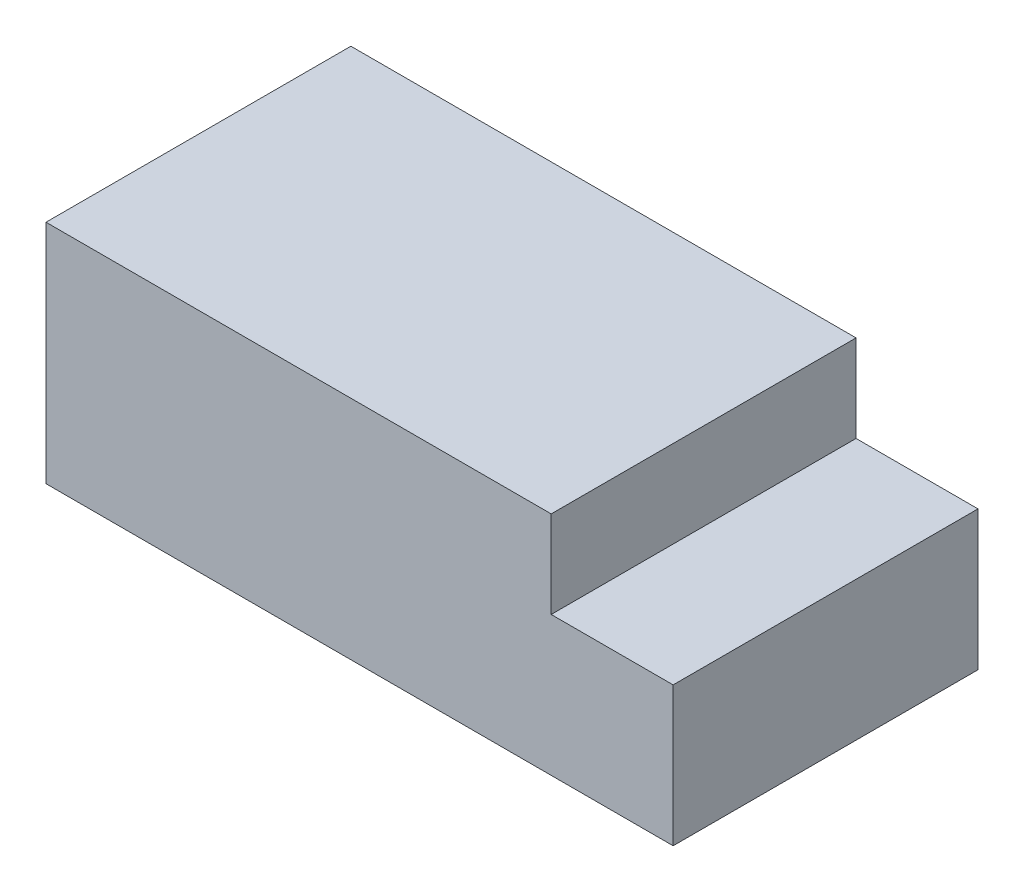
ISO-10303-21;
HEADER;
FILE_DESCRIPTION(('STEP AP214'),'2;1');
FILE_NAME('part.step','',(''),(''),'','','');
FILE_SCHEMA(('AUTOMOTIVE_DESIGN { 1 0 10303 214 1 1 1 1 }'));
ENDSEC;
DATA;
#1=APPLICATION_CONTEXT('core data for automotive mechanical design processes');
#2=APPLICATION_PROTOCOL_DEFINITION('international standard','automotive_design',2000,#1);
#3=PRODUCT_CONTEXT('',#1,'mechanical');
#4=PRODUCT('Part','Part','',(#3));
#5=PRODUCT_RELATED_PRODUCT_CATEGORY('part','',(#4));
#6=PRODUCT_DEFINITION_FORMATION('','',#4);
#7=PRODUCT_DEFINITION_CONTEXT('part definition',#1,'design');
#8=PRODUCT_DEFINITION('design','',#6,#7);
#9=PRODUCT_DEFINITION_SHAPE('','',#8);
#10=(LENGTH_UNIT() NAMED_UNIT(*) SI_UNIT(.MILLI.,.METRE.));
#11=(NAMED_UNIT(*) PLANE_ANGLE_UNIT() SI_UNIT($,.RADIAN.));
#12=(NAMED_UNIT(*) SI_UNIT($,.STERADIAN.) SOLID_ANGLE_UNIT());
#13=UNCERTAINTY_MEASURE_WITH_UNIT(LENGTH_MEASURE(1.E-05),#10,'distance_accuracy_value','');
#14=(GEOMETRIC_REPRESENTATION_CONTEXT(3) GLOBAL_UNCERTAINTY_ASSIGNED_CONTEXT((#13)) GLOBAL_UNIT_ASSIGNED_CONTEXT((#10,
#11,#12)) REPRESENTATION_CONTEXT('',''));
#15=CARTESIAN_POINT('',(0.,0.,0.));
#16=DIRECTION('',(0.,0.,1.));
#17=DIRECTION('',(1.,0.,0.));
#18=AXIS2_PLACEMENT_3D('',#15,#16,#17);
#19=CARTESIAN_POINT('',(14.5,6.5,8.75));
#20=DIRECTION('',(-1.,0.,0.));
#21=DIRECTION('',(0.,0.,1.));
#22=AXIS2_PLACEMENT_3D('',#19,#20,#21);
#23=PLANE('',#22);
#24=DIRECTION('',(0.,0.,1.));
#25=VECTOR('',#24,1.);
#26=CARTESIAN_POINT('',(14.5,1.5,8.75));
#27=LINE('',#26,#25);
#28=CARTESIAN_POINT('',(14.5,1.5,-8.75));
#29=VERTEX_POINT('',#28);
#30=CARTESIAN_POINT('',(14.5,1.5,8.75));
#31=VERTEX_POINT('',#30);
#32=EDGE_CURVE('E55',#29,#31,#27,.T.);
#33=ORIENTED_EDGE('',*,*,#32,.F.);
#34=DIRECTION('',(0.,-1.,0.));
#35=VECTOR('',#34,1.);
#36=CARTESIAN_POINT('',(14.5,6.5,-8.75));
#37=LINE('',#36,#35);
#38=CARTESIAN_POINT('',(14.5,6.5,-8.75));
#39=VERTEX_POINT('',#38);
#40=EDGE_CURVE('E11',#39,#29,#37,.T.);
#41=ORIENTED_EDGE('',*,*,#40,.F.);
#42=DIRECTION('',(0.,0.,-1.));
#43=VECTOR('',#42,1.);
#44=CARTESIAN_POINT('',(14.5,6.5,8.75));
#45=LINE('',#44,#43);
#46=CARTESIAN_POINT('',(14.5,6.5,8.75));
#47=VERTEX_POINT('',#46);
#48=EDGE_CURVE('E111',#47,#39,#45,.T.);
#49=ORIENTED_EDGE('',*,*,#48,.F.);
#50=DIRECTION('',(0.,-1.,0.));
#51=VECTOR('',#50,1.);
#52=CARTESIAN_POINT('',(14.5,6.5,8.75));
#53=LINE('',#52,#51);
#54=EDGE_CURVE('E140',#47,#31,#53,.T.);
#55=ORIENTED_EDGE('',*,*,#54,.T.);
#56=EDGE_LOOP('',(#33,#41,#49,#55));
#57=FACE_BOUND('',#56,.T.);
#58=ADVANCED_FACE('F41',(#57),#23,.F.);
#59=CARTESIAN_POINT('',(-14.5,6.5,-8.75));
#60=DIRECTION('',(0.,0.,1.));
#61=DIRECTION('',(1.,0.,0.));
#62=AXIS2_PLACEMENT_3D('',#59,#60,#61);
#63=PLANE('',#62);
#64=DIRECTION('',(-1.,0.,0.));
#65=VECTOR('',#64,1.);
#66=CARTESIAN_POINT('',(-14.5,-6.5,-8.75));
#67=LINE('',#66,#65);
#68=CARTESIAN_POINT('',(21.5,-6.5,-8.75));
#69=VERTEX_POINT('',#68);
#70=CARTESIAN_POINT('',(-14.5,-6.5,-8.75));
#71=VERTEX_POINT('',#70);
#72=EDGE_CURVE('E116',#69,#71,#67,.T.);
#73=ORIENTED_EDGE('',*,*,#72,.T.);
#74=DIRECTION('',(0.,-1.,0.));
#75=VECTOR('',#74,1.);
#76=CARTESIAN_POINT('',(-14.5,6.5,-8.75));
#77=LINE('',#76,#75);
#78=CARTESIAN_POINT('',(-14.5,6.5,-8.75));
#79=VERTEX_POINT('',#78);
#80=EDGE_CURVE('E48',#79,#71,#77,.T.);
#81=ORIENTED_EDGE('',*,*,#80,.F.);
#82=DIRECTION('',(-1.,0.,0.));
#83=VECTOR('',#82,1.);
#84=CARTESIAN_POINT('',(-14.5,6.5,-8.75));
#85=LINE('',#84,#83);
#86=EDGE_CURVE('E86',#39,#79,#85,.T.);
#87=ORIENTED_EDGE('',*,*,#86,.F.);
#88=ORIENTED_EDGE('',*,*,#40,.T.);
#89=DIRECTION('',(-1.,0.,0.));
#90=VECTOR('',#89,1.);
#91=CARTESIAN_POINT('',(21.5,1.5,-8.75));
#92=LINE('',#91,#90);
#93=CARTESIAN_POINT('',(21.5,1.5,-8.75));
#94=VERTEX_POINT('',#93);
#95=EDGE_CURVE('E132',#94,#29,#92,.T.);
#96=ORIENTED_EDGE('',*,*,#95,.F.);
#97=DIRECTION('',(0.,1.,0.));
#98=VECTOR('',#97,1.);
#99=CARTESIAN_POINT('',(21.5,-6.5,-8.75));
#100=LINE('',#99,#98);
#101=EDGE_CURVE('E119',#69,#94,#100,.T.);
#102=ORIENTED_EDGE('',*,*,#101,.F.);
#103=EDGE_LOOP('',(#73,#81,#87,#88,#96,#102));
#104=FACE_BOUND('',#103,.T.);
#105=ADVANCED_FACE('F146',(#104),#63,.F.);
#106=CARTESIAN_POINT('',(-14.5,6.5,8.75));
#107=DIRECTION('',(1.,0.,0.));
#108=DIRECTION('',(0.,0.,-1.));
#109=AXIS2_PLACEMENT_3D('',#106,#107,#108);
#110=PLANE('',#109);
#111=DIRECTION('',(0.,0.,1.));
#112=VECTOR('',#111,1.);
#113=CARTESIAN_POINT('',(-14.5,-6.5,8.75));
#114=LINE('',#113,#112);
#115=CARTESIAN_POINT('',(-14.5,-6.5,8.75));
#116=VERTEX_POINT('',#115);
#117=EDGE_CURVE('E79',#71,#116,#114,.T.);
#118=ORIENTED_EDGE('',*,*,#117,.T.);
#119=DIRECTION('',(0.,-1.,0.));
#120=VECTOR('',#119,1.);
#121=CARTESIAN_POINT('',(-14.5,6.5,8.75));
#122=LINE('',#121,#120);
#123=CARTESIAN_POINT('',(-14.5,6.5,8.75));
#124=VERTEX_POINT('',#123);
#125=EDGE_CURVE('E109',#124,#116,#122,.T.);
#126=ORIENTED_EDGE('',*,*,#125,.F.);
#127=DIRECTION('',(0.,0.,1.));
#128=VECTOR('',#127,1.);
#129=CARTESIAN_POINT('',(-14.5,6.5,8.75));
#130=LINE('',#129,#128);
#131=EDGE_CURVE('E137',#79,#124,#130,.T.);
#132=ORIENTED_EDGE('',*,*,#131,.F.);
#133=ORIENTED_EDGE('',*,*,#80,.T.);
#134=EDGE_LOOP('',(#118,#126,#132,#133));
#135=FACE_BOUND('',#134,.T.);
#136=ADVANCED_FACE('F145',(#135),#110,.F.);
#137=CARTESIAN_POINT('',(-14.5,6.5,8.75));
#138=DIRECTION('',(0.,0.,-1.));
#139=DIRECTION('',(-1.,0.,0.));
#140=AXIS2_PLACEMENT_3D('',#137,#138,#139);
#141=PLANE('',#140);
#142=DIRECTION('',(1.,0.,0.));
#143=VECTOR('',#142,1.);
#144=CARTESIAN_POINT('',(-14.5,-6.5,8.75));
#145=LINE('',#144,#143);
#146=CARTESIAN_POINT('',(21.5,-6.5,8.75));
#147=VERTEX_POINT('',#146);
#148=EDGE_CURVE('E103',#116,#147,#145,.T.);
#149=ORIENTED_EDGE('',*,*,#148,.T.);
#150=DIRECTION('',(0.,-1.,0.));
#151=VECTOR('',#150,1.);
#152=CARTESIAN_POINT('',(21.5,-6.5,8.75));
#153=LINE('',#152,#151);
#154=CARTESIAN_POINT('',(21.5,1.5,8.75));
#155=VERTEX_POINT('',#154);
#156=EDGE_CURVE('E108',#155,#147,#153,.T.);
#157=ORIENTED_EDGE('',*,*,#156,.F.);
#158=DIRECTION('',(-1.,0.,0.));
#159=VECTOR('',#158,1.);
#160=CARTESIAN_POINT('',(21.5,1.5,8.75));
#161=LINE('',#160,#159);
#162=EDGE_CURVE('E129',#155,#31,#161,.T.);
#163=ORIENTED_EDGE('',*,*,#162,.T.);
#164=ORIENTED_EDGE('',*,*,#54,.F.);
#165=DIRECTION('',(1.,0.,0.));
#166=VECTOR('',#165,1.);
#167=CARTESIAN_POINT('',(-14.5,6.5,8.75));
#168=LINE('',#167,#166);
#169=EDGE_CURVE('E63',#124,#47,#168,.T.);
#170=ORIENTED_EDGE('',*,*,#169,.F.);
#171=ORIENTED_EDGE('',*,*,#125,.T.);
#172=EDGE_LOOP('',(#149,#157,#163,#164,#170,#171));
#173=FACE_BOUND('',#172,.T.);
#174=ADVANCED_FACE('F105',(#173),#141,.F.);
#175=CARTESIAN_POINT('',(0.,6.5,0.));
#176=DIRECTION('',(0.,-1.,0.));
#177=DIRECTION('',(0.,0.,-1.));
#178=AXIS2_PLACEMENT_3D('',#175,#176,#177);
#179=PLANE('',#178);
#180=ORIENTED_EDGE('',*,*,#48,.T.);
#181=ORIENTED_EDGE('',*,*,#86,.T.);
#182=ORIENTED_EDGE('',*,*,#131,.T.);
#183=ORIENTED_EDGE('',*,*,#169,.T.);
#184=EDGE_LOOP('',(#180,#181,#182,#183));
#185=FACE_BOUND('',#184,.T.);
#186=ADVANCED_FACE('F151',(#185),#179,.F.);
#187=CARTESIAN_POINT('',(0.,-6.5,0.));
#188=DIRECTION('',(0.,-1.,0.));
#189=DIRECTION('',(0.,0.,-1.));
#190=AXIS2_PLACEMENT_3D('',#187,#188,#189);
#191=PLANE('',#190);
#192=ORIENTED_EDGE('',*,*,#72,.F.);
#193=DIRECTION('',(0.,0.,-1.));
#194=VECTOR('',#193,1.);
#195=CARTESIAN_POINT('',(21.5,-6.5,8.75));
#196=LINE('',#195,#194);
#197=EDGE_CURVE('E114',#147,#69,#196,.T.);
#198=ORIENTED_EDGE('',*,*,#197,.F.);
#199=ORIENTED_EDGE('',*,*,#148,.F.);
#200=ORIENTED_EDGE('',*,*,#117,.F.);
#201=EDGE_LOOP('',(#192,#198,#199,#200));
#202=FACE_BOUND('',#201,.T.);
#203=ADVANCED_FACE('F115',(#202),#191,.T.);
#204=CARTESIAN_POINT('',(21.5,1.5,8.75));
#205=DIRECTION('',(0.,-1.,0.));
#206=DIRECTION('',(0.,0.,-1.));
#207=AXIS2_PLACEMENT_3D('',#204,#205,#206);
#208=PLANE('',#207);
#209=ORIENTED_EDGE('',*,*,#32,.T.);
#210=ORIENTED_EDGE('',*,*,#162,.F.);
#211=DIRECTION('',(0.,0.,1.));
#212=VECTOR('',#211,1.);
#213=CARTESIAN_POINT('',(21.5,1.5,8.75));
#214=LINE('',#213,#212);
#215=EDGE_CURVE('E123',#94,#155,#214,.T.);
#216=ORIENTED_EDGE('',*,*,#215,.F.);
#217=ORIENTED_EDGE('',*,*,#95,.T.);
#218=EDGE_LOOP('',(#209,#210,#216,#217));
#219=FACE_BOUND('',#218,.T.);
#220=ADVANCED_FACE('F149',(#219),#208,.F.);
#221=CARTESIAN_POINT('',(21.5,0.,0.));
#222=DIRECTION('',(-1.,0.,0.));
#223=DIRECTION('',(0.,0.,1.));
#224=AXIS2_PLACEMENT_3D('',#221,#222,#223);
#225=PLANE('',#224);
#226=ORIENTED_EDGE('',*,*,#156,.T.);
#227=ORIENTED_EDGE('',*,*,#197,.T.);
#228=ORIENTED_EDGE('',*,*,#101,.T.);
#229=ORIENTED_EDGE('',*,*,#215,.T.);
#230=EDGE_LOOP('',(#226,#227,#228,#229));
#231=FACE_BOUND('',#230,.T.);
#232=ADVANCED_FACE('F121',(#231),#225,.F.);
#233=CLOSED_SHELL('',(#58,#105,#136,#174,#186,#203,#220,#232));
#234=MANIFOLD_SOLID_BREP('B2',#233);
#235=ADVANCED_BREP_SHAPE_REPRESENTATION('',(#18,#234),#14);
#236=SHAPE_DEFINITION_REPRESENTATION(#9,#235);
ENDSEC;
END-ISO-10303-21;
